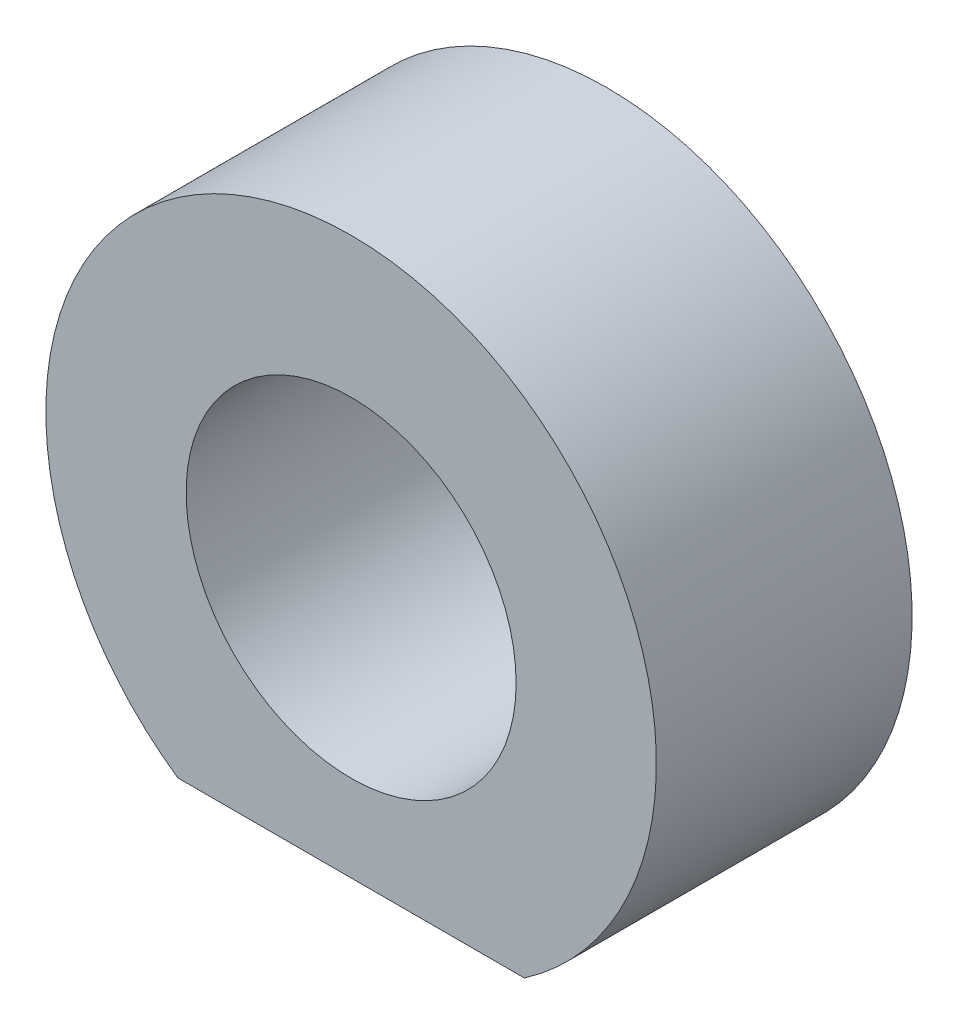
ISO-10303-21;
HEADER;
FILE_DESCRIPTION(('STEP AP214'),'2;1');
FILE_NAME('part.step','',(''),(''),'','','');
FILE_SCHEMA(('AUTOMOTIVE_DESIGN { 1 0 10303 214 1 1 1 1 }'));
ENDSEC;
DATA;
#1=APPLICATION_CONTEXT('core data for automotive mechanical design processes');
#2=APPLICATION_PROTOCOL_DEFINITION('international standard','automotive_design',2000,#1);
#3=PRODUCT_CONTEXT('',#1,'mechanical');
#4=PRODUCT('Part','Part','',(#3));
#5=PRODUCT_RELATED_PRODUCT_CATEGORY('part','',(#4));
#6=PRODUCT_DEFINITION_FORMATION('','',#4);
#7=PRODUCT_DEFINITION_CONTEXT('part definition',#1,'design');
#8=PRODUCT_DEFINITION('design','',#6,#7);
#9=PRODUCT_DEFINITION_SHAPE('','',#8);
#10=(LENGTH_UNIT() NAMED_UNIT(*) SI_UNIT(.MILLI.,.METRE.));
#11=(NAMED_UNIT(*) PLANE_ANGLE_UNIT() SI_UNIT($,.RADIAN.));
#12=(NAMED_UNIT(*) SI_UNIT($,.STERADIAN.) SOLID_ANGLE_UNIT());
#13=UNCERTAINTY_MEASURE_WITH_UNIT(LENGTH_MEASURE(1.E-05),#10,'distance_accuracy_value','');
#14=(GEOMETRIC_REPRESENTATION_CONTEXT(3) GLOBAL_UNCERTAINTY_ASSIGNED_CONTEXT((#13)) GLOBAL_UNIT_ASSIGNED_CONTEXT((#10,
#11,#12)) REPRESENTATION_CONTEXT('',''));
#15=CARTESIAN_POINT('',(0.,0.,0.));
#16=DIRECTION('',(0.,0.,1.));
#17=DIRECTION('',(1.,0.,0.));
#18=AXIS2_PLACEMENT_3D('',#15,#16,#17);
#19=CARTESIAN_POINT('',(0.,0.,7.75));
#20=DIRECTION('',(0.,0.,1.));
#21=DIRECTION('',(1.,0.,0.));
#22=AXIS2_PLACEMENT_3D('',#19,#20,#21);
#23=PLANE('',#22);
#24=CARTESIAN_POINT('',(0.,0.,7.75));
#25=DIRECTION('',(0.,0.,1.));
#26=DIRECTION('',(1.,0.,0.));
#27=AXIS2_PLACEMENT_3D('',#24,#25,#26);
#28=CIRCLE('',#27,18.5);
#29=CARTESIAN_POINT('',(10.5000995596283,-15.2314775789446,7.75));
#30=VERTEX_POINT('',#29);
#31=CARTESIAN_POINT('',(-10.5000995596283,-15.2314775789446,7.75));
#32=VERTEX_POINT('',#31);
#33=EDGE_CURVE('E72',#30,#32,#28,.T.);
#34=ORIENTED_EDGE('',*,*,#33,.T.);
#35=DIRECTION('',(1.,0.,0.));
#36=VECTOR('',#35,1.);
#37=CARTESIAN_POINT('',(-10.5000995596283,-15.2314775789446,7.75));
#38=LINE('',#37,#36);
#39=EDGE_CURVE('E57',#32,#30,#38,.T.);
#40=ORIENTED_EDGE('',*,*,#39,.T.);
#41=EDGE_LOOP('',(#34,#40));
#42=FACE_BOUND('',#41,.T.);
#43=CARTESIAN_POINT('',(0.,0.,7.75));
#44=DIRECTION('',(0.,0.,1.));
#45=DIRECTION('',(1.,0.,0.));
#46=AXIS2_PLACEMENT_3D('',#43,#44,#45);
#47=CIRCLE('',#46,10.);
#48=CARTESIAN_POINT('',(10.,0.,7.75));
#49=VERTEX_POINT('',#48);
#50=EDGE_CURVE('E78',#49,#49,#47,.T.);
#51=ORIENTED_EDGE('',*,*,#50,.F.);
#52=EDGE_LOOP('',(#51));
#53=FACE_BOUND('',#52,.T.);
#54=ADVANCED_FACE('F41',(#42,#53),#23,.T.);
#55=CARTESIAN_POINT('',(0.,0.,-7.75));
#56=DIRECTION('',(0.,0.,1.));
#57=DIRECTION('',(1.,0.,0.));
#58=AXIS2_PLACEMENT_3D('',#55,#56,#57);
#59=PLANE('',#58);
#60=CARTESIAN_POINT('',(0.,0.,-7.75));
#61=DIRECTION('',(0.,0.,1.));
#62=DIRECTION('',(1.,0.,0.));
#63=AXIS2_PLACEMENT_3D('',#60,#61,#62);
#64=CIRCLE('',#63,18.5);
#65=CARTESIAN_POINT('',(10.5000995596283,-15.2314775789446,-7.75));
#66=VERTEX_POINT('',#65);
#67=CARTESIAN_POINT('',(-10.5000995596283,-15.2314775789446,-7.75));
#68=VERTEX_POINT('',#67);
#69=EDGE_CURVE('E73',#66,#68,#64,.T.);
#70=ORIENTED_EDGE('',*,*,#69,.F.);
#71=DIRECTION('',(1.,0.,0.));
#72=VECTOR('',#71,1.);
#73=CARTESIAN_POINT('',(-10.5000995596283,-15.2314775789446,-7.75));
#74=LINE('',#73,#72);
#75=EDGE_CURVE('E65',#68,#66,#74,.T.);
#76=ORIENTED_EDGE('',*,*,#75,.F.);
#77=EDGE_LOOP('',(#70,#76));
#78=FACE_BOUND('',#77,.T.);
#79=CARTESIAN_POINT('',(0.,0.,-7.75));
#80=DIRECTION('',(0.,0.,1.));
#81=DIRECTION('',(1.,0.,0.));
#82=AXIS2_PLACEMENT_3D('',#79,#80,#81);
#83=CIRCLE('',#82,10.);
#84=CARTESIAN_POINT('',(10.,0.,-7.75));
#85=VERTEX_POINT('',#84);
#86=EDGE_CURVE('E81',#85,#85,#83,.T.);
#87=ORIENTED_EDGE('',*,*,#86,.T.);
#88=EDGE_LOOP('',(#87));
#89=FACE_BOUND('',#88,.T.);
#90=ADVANCED_FACE('F76',(#78,#89),#59,.F.);
#91=CARTESIAN_POINT('',(0.,0.,7.75));
#92=DIRECTION('',(0.,0.,-1.));
#93=DIRECTION('',(-1.,0.,0.));
#94=AXIS2_PLACEMENT_3D('',#91,#92,#93);
#95=CYLINDRICAL_SURFACE('',#94,18.5);
#96=ORIENTED_EDGE('',*,*,#69,.T.);
#97=DIRECTION('',(0.,0.,-1.));
#98=VECTOR('',#97,1.);
#99=CARTESIAN_POINT('',(-10.5000995596283,-15.2314775789446,7.75));
#100=LINE('',#99,#98);
#101=EDGE_CURVE('E11',#32,#68,#100,.T.);
#102=ORIENTED_EDGE('',*,*,#101,.F.);
#103=ORIENTED_EDGE('',*,*,#33,.F.);
#104=DIRECTION('',(0.,0.,-1.));
#105=VECTOR('',#104,1.);
#106=CARTESIAN_POINT('',(10.5000995596283,-15.2314775789446,7.75));
#107=LINE('',#106,#105);
#108=EDGE_CURVE('E50',#30,#66,#107,.T.);
#109=ORIENTED_EDGE('',*,*,#108,.T.);
#110=EDGE_LOOP('',(#96,#102,#103,#109));
#111=FACE_BOUND('',#110,.T.);
#112=ADVANCED_FACE('F43',(#111),#95,.T.);
#113=CARTESIAN_POINT('',(-10.5000995596283,-15.2314775789446,7.75));
#114=DIRECTION('',(0.,1.,0.));
#115=DIRECTION('',(0.,0.,1.));
#116=AXIS2_PLACEMENT_3D('',#113,#114,#115);
#117=PLANE('',#116);
#118=ORIENTED_EDGE('',*,*,#75,.T.);
#119=ORIENTED_EDGE('',*,*,#108,.F.);
#120=ORIENTED_EDGE('',*,*,#39,.F.);
#121=ORIENTED_EDGE('',*,*,#101,.T.);
#122=EDGE_LOOP('',(#118,#119,#120,#121));
#123=FACE_BOUND('',#122,.T.);
#124=ADVANCED_FACE('F68',(#123),#117,.F.);
#125=CARTESIAN_POINT('',(0.,0.,7.75));
#126=DIRECTION('',(0.,0.,-1.));
#127=DIRECTION('',(-1.,0.,0.));
#128=AXIS2_PLACEMENT_3D('',#125,#126,#127);
#129=CYLINDRICAL_SURFACE('',#128,10.);
#130=ORIENTED_EDGE('',*,*,#50,.T.);
#131=EDGE_LOOP('',(#130));
#132=FACE_BOUND('',#131,.T.);
#133=ORIENTED_EDGE('',*,*,#86,.F.);
#134=EDGE_LOOP('',(#133));
#135=FACE_BOUND('',#134,.T.);
#136=ADVANCED_FACE('F89',(#132,#135),#129,.F.);
#137=CLOSED_SHELL('',(#54,#90,#112,#124,#136));
#138=MANIFOLD_SOLID_BREP('B2',#137);
#139=ADVANCED_BREP_SHAPE_REPRESENTATION('',(#18,#138),#14);
#140=SHAPE_DEFINITION_REPRESENTATION(#9,#139);
ENDSEC;
END-ISO-10303-21;
